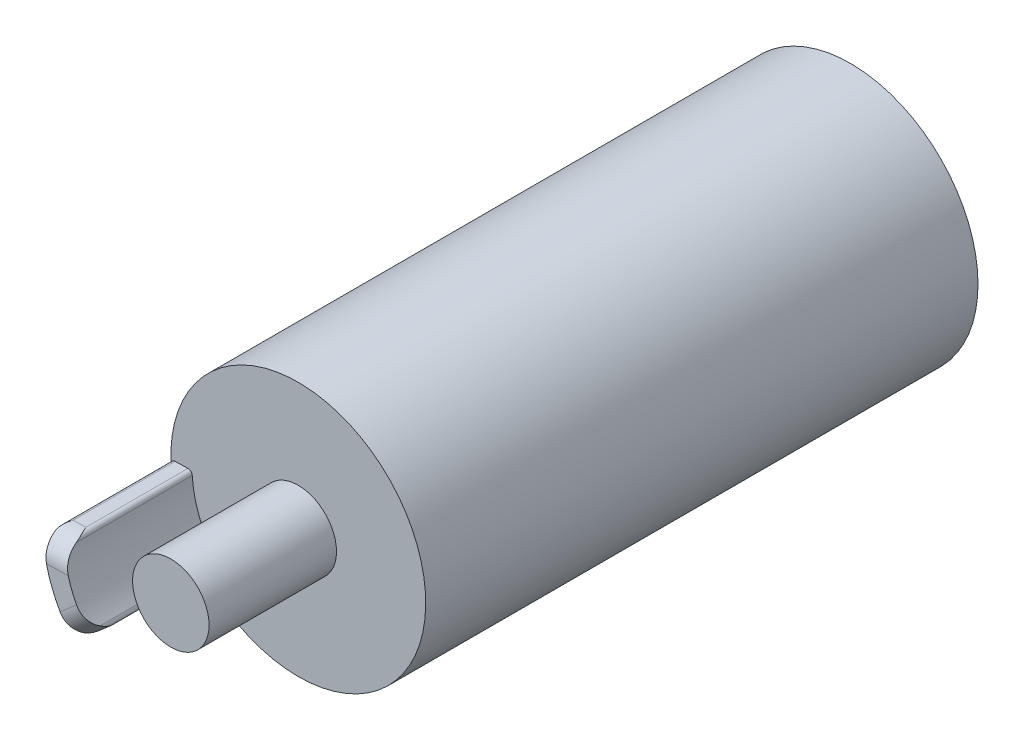
ISO-10303-21;
HEADER;
FILE_DESCRIPTION(('STEP AP214'),'2;1');
FILE_NAME('part.step','',(''),(''),'','','');
FILE_SCHEMA(('AUTOMOTIVE_DESIGN { 1 0 10303 214 1 1 1 1 }'));
ENDSEC;
DATA;
#1=APPLICATION_CONTEXT('core data for automotive mechanical design processes');
#2=APPLICATION_PROTOCOL_DEFINITION('international standard','automotive_design',2000,#1);
#3=PRODUCT_CONTEXT('',#1,'mechanical');
#4=PRODUCT('Part','Part','',(#3));
#5=PRODUCT_RELATED_PRODUCT_CATEGORY('part','',(#4));
#6=PRODUCT_DEFINITION_FORMATION('','',#4);
#7=PRODUCT_DEFINITION_CONTEXT('part definition',#1,'design');
#8=PRODUCT_DEFINITION('design','',#6,#7);
#9=PRODUCT_DEFINITION_SHAPE('','',#8);
#10=(LENGTH_UNIT() NAMED_UNIT(*) SI_UNIT(.MILLI.,.METRE.));
#11=(NAMED_UNIT(*) PLANE_ANGLE_UNIT() SI_UNIT($,.RADIAN.));
#12=(NAMED_UNIT(*) SI_UNIT($,.STERADIAN.) SOLID_ANGLE_UNIT());
#13=UNCERTAINTY_MEASURE_WITH_UNIT(LENGTH_MEASURE(1.E-05),#10,'distance_accuracy_value','');
#14=(GEOMETRIC_REPRESENTATION_CONTEXT(3) GLOBAL_UNCERTAINTY_ASSIGNED_CONTEXT((#13)) GLOBAL_UNIT_ASSIGNED_CONTEXT((#10,
#11,#12)) REPRESENTATION_CONTEXT('',''));
#15=CARTESIAN_POINT('',(0.,0.,0.));
#16=DIRECTION('',(0.,0.,1.));
#17=DIRECTION('',(1.,0.,0.));
#18=AXIS2_PLACEMENT_3D('',#15,#16,#17);
#19=CARTESIAN_POINT('',(0.,0.,13.));
#20=DIRECTION('',(0.,0.,1.));
#21=DIRECTION('',(1.,0.,0.));
#22=AXIS2_PLACEMENT_3D('',#19,#20,#21);
#23=PLANE('',#22);
#24=CARTESIAN_POINT('',(0.,0.,13.));
#25=DIRECTION('',(0.,0.,1.));
#26=DIRECTION('',(1.,0.,0.));
#27=AXIS2_PLACEMENT_3D('',#24,#25,#26);
#28=CIRCLE('',#27,0.9);
#29=CARTESIAN_POINT('',(0.9,0.,13.));
#30=VERTEX_POINT('',#29);
#31=EDGE_CURVE('E189',#30,#30,#28,.F.);
#32=ORIENTED_EDGE('',*,*,#31,.T.);
#33=EDGE_LOOP('',(#32));
#34=FACE_BOUND('',#33,.T.);
#35=DIRECTION('',(0.752217287045715,0.65891513343494,0.));
#36=VECTOR('',#35,1.);
#37=CARTESIAN_POINT('',(-1.9543178392422,-1.71191173347801,13.));
#38=LINE('',#37,#36);
#39=CARTESIAN_POINT('',(-2.1801328203152,-1.90971748847428,13.));
#40=VERTEX_POINT('',#39);
#41=CARTESIAN_POINT('',(-1.9543178392422,-1.71191173347801,13.));
#42=VERTEX_POINT('',#41);
#43=EDGE_CURVE('E146',#40,#42,#38,.T.);
#44=ORIENTED_EDGE('',*,*,#43,.F.);
#45=CARTESIAN_POINT('',(-2.24602433365869,-1.83449575976971,13.));
#46=DIRECTION('',(0.,0.,1.));
#47=DIRECTION('',(-1.,0.,0.));
#48=AXIS2_PLACEMENT_3D('',#45,#46,#47);
#49=CIRCLE('',#48,0.1);
#50=CARTESIAN_POINT('',(-2.32347344861244,-1.89775423424453,13.));
#51=VERTEX_POINT('',#50);
#52=EDGE_CURVE('E124',#51,#40,#49,.T.);
#53=ORIENTED_EDGE('',*,*,#52,.F.);
#54=CARTESIAN_POINT('',(0.,0.,13.));
#55=DIRECTION('',(0.,0.,1.));
#56=DIRECTION('',(1.,0.,0.));
#57=AXIS2_PLACEMENT_3D('',#54,#55,#56);
#58=CIRCLE('',#57,3.);
#59=CARTESIAN_POINT('',(-2.99534186834663,-0.167114008179209,13.));
#60=VERTEX_POINT('',#59);
#61=EDGE_CURVE('E132',#51,#60,#58,.T.);
#62=ORIENTED_EDGE('',*,*,#61,.T.);
#63=CARTESIAN_POINT('',(-2.89549713940174,-0.161543541239902,13.));
#64=DIRECTION('',(0.,0.,1.));
#65=DIRECTION('',(1.,0.,0.));
#66=AXIS2_PLACEMENT_3D('',#63,#64,#65);
#67=CIRCLE('',#66,0.0999999999999995);
#68=CARTESIAN_POINT('',(-2.89762137185673,-0.0615661056032692,13.));
#69=VERTEX_POINT('',#68);
#70=EDGE_CURVE('E164',#69,#60,#67,.T.);
#71=ORIENTED_EDGE('',*,*,#70,.F.);
#72=DIRECTION('',(-0.999774356366335,-0.021242324549825,0.));
#73=VECTOR('',#72,1.);
#74=CARTESIAN_POINT('',(-2.59748997199645,-0.055189178086747,13.));
#75=LINE('',#74,#73);
#76=CARTESIAN_POINT('',(-2.59748997199645,-0.055189178086747,13.));
#77=VERTEX_POINT('',#76);
#78=EDGE_CURVE('E161',#77,#69,#75,.T.);
#79=ORIENTED_EDGE('',*,*,#78,.F.);
#80=CARTESIAN_POINT('',(-2.59536573954147,-0.155166613723381,13.));
#81=DIRECTION('',(0.,0.,1.));
#82=DIRECTION('',(1.,0.,0.));
#83=AXIS2_PLACEMENT_3D('',#80,#81,#82);
#84=CIRCLE('',#83,0.1);
#85=CARTESIAN_POINT('',(-2.49554398032833,-0.149198667041711,13.));
#86=VERTEX_POINT('',#85);
#87=EDGE_CURVE('E158',#86,#77,#84,.T.);
#88=ORIENTED_EDGE('',*,*,#87,.F.);
#89=CARTESIAN_POINT('',(0.,0.,13.));
#90=DIRECTION('',(0.,0.,-1.));
#91=DIRECTION('',(1.,0.,0.));
#92=AXIS2_PLACEMENT_3D('',#89,#90,#91);
#93=CIRCLE('',#92,2.5);
#94=CARTESIAN_POINT('',(-1.94250899287086,-1.57374038920523,13.));
#95=VERTEX_POINT('',#94);
#96=EDGE_CURVE('E155',#95,#86,#93,.T.);
#97=ORIENTED_EDGE('',*,*,#96,.F.);
#98=CARTESIAN_POINT('',(-2.02020935258569,-1.63669000477344,13.));
#99=DIRECTION('',(0.,0.,1.));
#100=DIRECTION('',(-1.,0.,0.));
#101=AXIS2_PLACEMENT_3D('',#98,#99,#100);
#102=CIRCLE('',#101,0.0999999999999997);
#103=EDGE_CURVE('E148',#42,#95,#102,.T.);
#104=ORIENTED_EDGE('',*,*,#103,.F.);
#105=EDGE_LOOP('',(#44,#53,#62,#71,#79,#88,#97,#104));
#106=FACE_BOUND('',#105,.T.);
#107=ADVANCED_FACE('F38',(#34,#106),#23,.T.);
#108=CARTESIAN_POINT('',(0.,0.,13.));
#109=DIRECTION('',(0.,0.,-1.));
#110=DIRECTION('',(-1.,0.,0.));
#111=AXIS2_PLACEMENT_3D('',#108,#109,#110);
#112=CYLINDRICAL_SURFACE('',#111,1.8);
#113=CARTESIAN_POINT('',(0.,0.,0.));
#114=DIRECTION('',(0.,0.,1.));
#115=DIRECTION('',(1.,0.,0.));
#116=AXIS2_PLACEMENT_3D('',#113,#114,#115);
#117=CIRCLE('',#116,1.8);
#118=CARTESIAN_POINT('',(-1.8,0.,0.));
#119=VERTEX_POINT('',#118);
#120=EDGE_CURVE('E193',#119,#119,#117,.T.);
#121=CARTESIAN_POINT('',(0.,0.,12.));
#122=DIRECTION('',(0.,0.,1.));
#123=DIRECTION('',(1.,0.,0.));
#124=AXIS2_PLACEMENT_3D('',#121,#122,#123);
#125=CIRCLE('',#124,1.8);
#126=CARTESIAN_POINT('',(-1.8,0.,12.));
#127=VERTEX_POINT('',#126);
#128=EDGE_CURVE('E192',#127,#127,#125,.T.);
#129=CARTESIAN_POINT('',(-1.8,0.,0.));
#130=CARTESIAN_POINT('',(-1.8,0.,0.125));
#131=CARTESIAN_POINT('',(-1.8,0.,0.25));
#132=CARTESIAN_POINT('',(-1.8,0.,0.5));
#133=CARTESIAN_POINT('',(-1.8,0.,0.625000000000001));
#134=CARTESIAN_POINT('',(-1.8,0.,0.875000000000001));
#135=CARTESIAN_POINT('',(-1.8,0.,1.));
#136=CARTESIAN_POINT('',(-1.8,0.,1.25));
#137=CARTESIAN_POINT('',(-1.8,0.,1.375));
#138=CARTESIAN_POINT('',(-1.8,0.,1.625));
#139=CARTESIAN_POINT('',(-1.8,0.,1.75));
#140=CARTESIAN_POINT('',(-1.8,0.,2.));
#141=CARTESIAN_POINT('',(-1.8,0.,2.125));
#142=CARTESIAN_POINT('',(-1.8,0.,2.375));
#143=CARTESIAN_POINT('',(-1.8,0.,2.5));
#144=CARTESIAN_POINT('',(-1.8,0.,2.75));
#145=CARTESIAN_POINT('',(-1.8,0.,2.875));
#146=CARTESIAN_POINT('',(-1.8,0.,3.125));
#147=CARTESIAN_POINT('',(-1.8,0.,3.25));
#148=CARTESIAN_POINT('',(-1.8,0.,3.5));
#149=CARTESIAN_POINT('',(-1.8,0.,3.625));
#150=CARTESIAN_POINT('',(-1.8,0.,3.875));
#151=CARTESIAN_POINT('',(-1.8,0.,4.));
#152=CARTESIAN_POINT('',(-1.8,0.,4.25));
#153=CARTESIAN_POINT('',(-1.8,0.,4.375));
#154=CARTESIAN_POINT('',(-1.8,0.,4.625));
#155=CARTESIAN_POINT('',(-1.8,0.,4.75));
#156=CARTESIAN_POINT('',(-1.8,0.,5.));
#157=CARTESIAN_POINT('',(-1.8,0.,5.125));
#158=CARTESIAN_POINT('',(-1.8,0.,5.375));
#159=CARTESIAN_POINT('',(-1.8,0.,5.5));
#160=CARTESIAN_POINT('',(-1.8,0.,5.75));
#161=CARTESIAN_POINT('',(-1.8,0.,5.875));
#162=CARTESIAN_POINT('',(-1.8,0.,6.125));
#163=CARTESIAN_POINT('',(-1.8,0.,6.25));
#164=CARTESIAN_POINT('',(-1.8,0.,6.5));
#165=CARTESIAN_POINT('',(-1.8,0.,6.625));
#166=CARTESIAN_POINT('',(-1.8,0.,6.875));
#167=CARTESIAN_POINT('',(-1.8,0.,7.));
#168=CARTESIAN_POINT('',(-1.8,0.,7.25));
#169=CARTESIAN_POINT('',(-1.8,0.,7.375));
#170=CARTESIAN_POINT('',(-1.8,0.,7.625));
#171=CARTESIAN_POINT('',(-1.8,0.,7.75));
#172=CARTESIAN_POINT('',(-1.8,0.,8.));
#173=CARTESIAN_POINT('',(-1.8,0.,8.125));
#174=CARTESIAN_POINT('',(-1.8,0.,8.375));
#175=CARTESIAN_POINT('',(-1.8,0.,8.5));
#176=CARTESIAN_POINT('',(-1.8,0.,8.75));
#177=CARTESIAN_POINT('',(-1.8,0.,8.875));
#178=CARTESIAN_POINT('',(-1.8,0.,9.125));
#179=CARTESIAN_POINT('',(-1.8,0.,9.25));
#180=CARTESIAN_POINT('',(-1.8,0.,9.5));
#181=CARTESIAN_POINT('',(-1.8,0.,9.625));
#182=CARTESIAN_POINT('',(-1.8,0.,9.875));
#183=CARTESIAN_POINT('',(-1.8,0.,10.));
#184=CARTESIAN_POINT('',(-1.8,0.,10.25));
#185=CARTESIAN_POINT('',(-1.8,0.,10.375));
#186=CARTESIAN_POINT('',(-1.8,0.,10.625));
#187=CARTESIAN_POINT('',(-1.8,0.,10.75));
#188=CARTESIAN_POINT('',(-1.8,0.,11.));
#189=CARTESIAN_POINT('',(-1.8,0.,11.125));
#190=CARTESIAN_POINT('',(-1.8,0.,11.375));
#191=CARTESIAN_POINT('',(-1.8,0.,11.5));
#192=CARTESIAN_POINT('',(-1.8,0.,11.75));
#193=CARTESIAN_POINT('',(-1.8,0.,11.875));
#194=CARTESIAN_POINT('',(-1.8,0.,12.));
#195=B_SPLINE_CURVE_WITH_KNOTS('',3,(#129,#130,#131,#132,#133,#134,#135,#136,#137,#138,#139,
#140,#141,#142,#143,#144,#145,#146,#147,#148,#149,#150,#151,#152,#153,#154,#155,#156,#157,#158,
#159,#160,#161,#162,#163,#164,#165,#166,#167,#168,#169,#170,#171,#172,#173,#174,#175,#176,#177,
#178,#179,#180,#181,#182,#183,#184,#185,#186,#187,#188,#189,#190,#191,#192,#193,#194),
.UNSPECIFIED.,.F.,.F.,(4,2,2,2,2,2,2,2,2,2,2,2,2,2,2,2,2,2,2,2,2,2,2,2,2,2,2,2,2,2,2,2,4),(0.,
0.375,0.750000000000001,1.125,1.5,1.875,2.25,2.625,3.,3.375,3.75,4.125,4.5,4.875,5.25,5.625,6.,
6.375,6.75,7.125,7.5,7.875,8.25,8.625,9.,9.375,9.75,10.125,10.5,10.875,11.25,11.625,12.),.UNSPECIFIED.);
#196=EDGE_CURVE('BSEAM312',#119,#127,#195,.T.);
#197=ORIENTED_EDGE('',*,*,#120,.F.);
#198=ORIENTED_EDGE('',*,*,#128,.T.);
#199=ORIENTED_EDGE('',*,*,#196,.T.);
#200=ORIENTED_EDGE('',*,*,#196,.F.);
#201=EDGE_LOOP('',(#197,#199,#198,#200));
#202=FACE_BOUND('',#201,.T.);
#203=ADVANCED_FACE('F312',(#202),#112,.F.);
#204=CARTESIAN_POINT('',(0.,0.,0.));
#205=DIRECTION('',(0.,0.,1.));
#206=DIRECTION('',(1.,0.,0.));
#207=AXIS2_PLACEMENT_3D('',#204,#205,#206);
#208=PLANE('',#207);
#209=CARTESIAN_POINT('',(0.,0.,0.));
#210=DIRECTION('',(0.,0.,1.));
#211=DIRECTION('',(1.,0.,0.));
#212=AXIS2_PLACEMENT_3D('',#209,#210,#211);
#213=CIRCLE('',#212,3.);
#214=CARTESIAN_POINT('',(3.,0.,0.));
#215=VERTEX_POINT('',#214);
#216=EDGE_CURVE('E141',#215,#215,#213,.T.);
#217=ORIENTED_EDGE('',*,*,#216,.F.);
#218=EDGE_LOOP('',(#217));
#219=FACE_BOUND('',#218,.T.);
#220=ORIENTED_EDGE('',*,*,#120,.T.);
#221=EDGE_LOOP('',(#220));
#222=FACE_BOUND('',#221,.T.);
#223=ADVANCED_FACE('F225',(#219,#222),#208,.F.);
#224=CARTESIAN_POINT('',(0.,0.,13.));
#225=DIRECTION('',(0.,0.,-1.));
#226=DIRECTION('',(-1.,0.,0.));
#227=AXIS2_PLACEMENT_3D('',#224,#225,#226);
#228=CYLINDRICAL_SURFACE('',#227,3.);
#229=CARTESIAN_POINT('',(0.,0.,16.));
#230=DIRECTION('',(0.,0.,1.));
#231=DIRECTION('',(1.,0.,0.));
#232=AXIS2_PLACEMENT_3D('',#229,#230,#231);
#233=CIRCLE('',#232,3.);
#234=CARTESIAN_POINT('',(-2.9259790424905,-0.662304041137002,16.));
#235=VERTEX_POINT('',#234);
#236=CARTESIAN_POINT('',(-2.60640731481617,-1.48547666062876,16.));
#237=VERTEX_POINT('',#236);
#238=EDGE_CURVE('E129',#235,#237,#233,.T.);
#239=ORIENTED_EDGE('',*,*,#238,.F.);
#240=CARTESIAN_POINT('',(-2.9259790424905,-0.662304041137002,16.));
#241=CARTESIAN_POINT('',(-2.93344017588472,-0.629440230710288,16.0000327749738));
#242=CARTESIAN_POINT('',(-2.94030690482443,-0.596436051882366,15.9972761598285));
#243=CARTESIAN_POINT('',(-2.95278636173561,-0.531150687062504,15.9863011016426));
#244=CARTESIAN_POINT('',(-2.95840065685799,-0.498868643525983,15.9780895360874));
#245=CARTESIAN_POINT('',(-2.96833639573226,-0.435897606090179,15.9563050942699));
#246=CARTESIAN_POINT('',(-2.97265593218248,-0.405211016871969,15.9427243763182));
#247=CARTESIAN_POINT('',(-2.98007720302971,-0.346432663319819,15.910557549508));
#248=CARTESIAN_POINT('',(-2.98317932036184,-0.318340085177884,15.8919730176889));
#249=CARTESIAN_POINT('',(-2.98810836225695,-0.267943521462508,15.8521579695631));
#250=CARTESIAN_POINT('',(-2.99002374534464,-0.245347385821983,15.8313063692612));
#251=CARTESIAN_POINT('',(-2.99316074453834,-0.203543874675177,15.7863593462375));
#252=CARTESIAN_POINT('',(-2.99438163048752,-0.184340080259205,15.7622605423723));
#253=CARTESIAN_POINT('',(-2.99534186834663,-0.16711400817921,15.7368031847469));
#254=B_SPLINE_CURVE_WITH_KNOTS('',3,(#240,#241,#242,#243,#244,#245,#246,#247,#248,#249,#250,
#251,#252,#253),.UNSPECIFIED.,.F.,.F.,(4,2,2,2,2,2,4),(0.,0.100990458432857,0.201853831286564,
0.302865063340039,0.403844497130937,0.495901076947136,0.588054262053954),.UNSPECIFIED.);
#255=CARTESIAN_POINT('',(-2.99534186834663,-0.167114008179209,15.7368031847469));
#256=VERTEX_POINT('',#255);
#257=EDGE_CURVE('E215',#235,#256,#254,.T.);
#258=ORIENTED_EDGE('',*,*,#257,.T.);
#259=DIRECTION('',(0.,0.,-1.));
#260=VECTOR('',#259,1.);
#261=CARTESIAN_POINT('',(-2.99534186834663,-0.167114008179209,16.));
#262=LINE('',#261,#260);
#263=EDGE_CURVE('E128',#256,#60,#262,.T.);
#264=ORIENTED_EDGE('',*,*,#263,.T.);
#265=ORIENTED_EDGE('',*,*,#61,.F.);
#266=DIRECTION('',(0.,0.,-1.));
#267=VECTOR('',#266,1.);
#268=CARTESIAN_POINT('',(-2.32347344861244,-1.89775423424453,16.));
#269=LINE('',#268,#267);
#270=CARTESIAN_POINT('',(-2.32347344861244,-1.89775423424453,15.7368031847469));
#271=VERTEX_POINT('',#270);
#272=EDGE_CURVE('E120',#271,#51,#269,.T.);
#273=ORIENTED_EDGE('',*,*,#272,.F.);
#274=CARTESIAN_POINT('',(-2.32347344861244,-1.89775423424453,15.7368031847469));
#275=CARTESIAN_POINT('',(-2.33535173227123,-1.88321480034998,15.7645220014843));
#276=CARTESIAN_POINT('',(-2.34859011423977,-1.86672589056757,15.7906264797424));
#277=CARTESIAN_POINT('',(-2.37711433984957,-1.83026172492721,15.838914328036));
#278=CARTESIAN_POINT('',(-2.39239661816057,-1.8102925220367,15.8611043734454));
#279=CARTESIAN_POINT('',(-2.42439852000105,-1.76720445144135,15.9009923524608));
#280=CARTESIAN_POINT('',(-2.4411196752949,-1.7440822114588,15.9186854175718));
#281=CARTESIAN_POINT('',(-2.47528958265152,-1.69523748992887,15.9490753852537));
#282=CARTESIAN_POINT('',(-2.49273830722924,-1.66951510655377,15.9617724763666));
#283=CARTESIAN_POINT('',(-2.52651067983955,-1.61790715121464,15.981181638981));
#284=CARTESIAN_POINT('',(-2.54283138662521,-1.59214796295996,15.9882376885445));
#285=CARTESIAN_POINT('',(-2.57505463555407,-1.53950379171852,15.9976600456921));
#286=CARTESIAN_POINT('',(-2.5909568330779,-1.51261792545487,16.0000226007507));
#287=CARTESIAN_POINT('',(-2.60640731481617,-1.48547666062876,16.));
#288=B_SPLINE_CURVE_WITH_KNOTS('',3,(#274,#275,#276,#277,#278,#279,#280,#281,#282,#283,#284,
#285,#286,#287),.UNSPECIFIED.,.F.,.F.,(4,2,2,2,2,2,4),(0.,0.100309155347823,0.200445561762977,
0.300689919896136,0.400930494567482,0.494455442379958,0.588055134869861),.UNSPECIFIED.);
#289=EDGE_CURVE('E208',#271,#237,#288,.T.);
#290=ORIENTED_EDGE('',*,*,#289,.T.);
#291=EDGE_LOOP('',(#239,#258,#264,#265,#273,#290));
#292=FACE_BOUND('',#291,.T.);
#293=ORIENTED_EDGE('',*,*,#216,.T.);
#294=EDGE_LOOP('',(#293));
#295=FACE_BOUND('',#294,.T.);
#296=ADVANCED_FACE('F134',(#292,#295),#228,.T.);
#297=CARTESIAN_POINT('',(0.,0.,12.));
#298=DIRECTION('',(0.,0.,1.));
#299=DIRECTION('',(1.,0.,0.));
#300=AXIS2_PLACEMENT_3D('',#297,#298,#299);
#301=PLANE('',#300);
#302=CARTESIAN_POINT('',(0.,0.,12.));
#303=DIRECTION('',(0.,0.,1.));
#304=DIRECTION('',(1.,0.,0.));
#305=AXIS2_PLACEMENT_3D('',#302,#303,#304);
#306=CIRCLE('',#305,0.9);
#307=CARTESIAN_POINT('',(0.9,0.,12.));
#308=VERTEX_POINT('',#307);
#309=EDGE_CURVE('E140',#308,#308,#306,.F.);
#310=ORIENTED_EDGE('',*,*,#309,.F.);
#311=EDGE_LOOP('',(#310));
#312=FACE_BOUND('',#311,.T.);
#313=ORIENTED_EDGE('',*,*,#128,.F.);
#314=EDGE_LOOP('',(#313));
#315=FACE_BOUND('',#314,.T.);
#316=ADVANCED_FACE('F224',(#312,#315),#301,.F.);
#317=CARTESIAN_POINT('',(0.,0.,2.5));
#318=DIRECTION('',(0.,0.,1.));
#319=DIRECTION('',(1.,0.,0.));
#320=AXIS2_PLACEMENT_3D('',#317,#318,#319);
#321=DEGENERATE_TOROIDAL_SURFACE('',#320,0.4,0.5,.T.);
#322=CARTESIAN_POINT('',(0.,0.,2.));
#323=DIRECTION('',(0.,0.,1.));
#324=DIRECTION('',(1.,0.,0.));
#325=AXIS2_PLACEMENT_3D('',#322,#323,#324);
#326=CIRCLE('',#325,0.4);
#327=CARTESIAN_POINT('',(0.4,0.,2.));
#328=VERTEX_POINT('',#327);
#329=EDGE_CURVE('E186',#328,#328,#326,.F.);
#330=ORIENTED_EDGE('',*,*,#329,.F.);
#331=EDGE_LOOP('',(#330));
#332=FACE_BOUND('',#331,.T.);
#333=CARTESIAN_POINT('',(0.,0.,2.5));
#334=DIRECTION('',(0.,0.,1.));
#335=DIRECTION('',(1.,0.,0.));
#336=AXIS2_PLACEMENT_3D('',#333,#334,#335);
#337=CIRCLE('',#336,0.9);
#338=CARTESIAN_POINT('',(0.9,0.,2.5));
#339=VERTEX_POINT('',#338);
#340=EDGE_CURVE('E183',#339,#339,#337,.T.);
#341=ORIENTED_EDGE('',*,*,#340,.F.);
#342=EDGE_LOOP('',(#341));
#343=FACE_BOUND('',#342,.T.);
#344=ADVANCED_FACE('F322',(#332,#343),#321,.T.);
#345=CARTESIAN_POINT('',(0.,0.,2.));
#346=DIRECTION('',(0.,0.,1.));
#347=DIRECTION('',(1.,0.,0.));
#348=AXIS2_PLACEMENT_3D('',#345,#346,#347);
#349=PLANE('',#348);
#350=ORIENTED_EDGE('',*,*,#329,.T.);
#351=EDGE_LOOP('',(#350));
#352=FACE_BOUND('',#351,.T.);
#353=ADVANCED_FACE('F326',(#352),#349,.F.);
#354=CARTESIAN_POINT('',(0.,0.,16.));
#355=DIRECTION('',(0.,0.,-1.));
#356=DIRECTION('',(-1.,0.,0.));
#357=AXIS2_PLACEMENT_3D('',#354,#355,#356);
#358=CYLINDRICAL_SURFACE('',#357,0.9);
#359=ORIENTED_EDGE('',*,*,#340,.T.);
#360=EDGE_LOOP('',(#359));
#361=FACE_BOUND('',#360,.T.);
#362=ORIENTED_EDGE('',*,*,#309,.T.);
#363=EDGE_LOOP('',(#362));
#364=FACE_BOUND('',#363,.T.);
#365=ADVANCED_FACE('F332',(#361,#364),#358,.T.);
#366=ORIENTED_EDGE('',*,*,#31,.F.);
#367=EDGE_LOOP('',(#366));
#368=FACE_BOUND('',#367,.T.);
#369=CARTESIAN_POINT('',(0.,0.,16.));
#370=DIRECTION('',(0.,0.,1.));
#371=DIRECTION('',(1.,0.,0.));
#372=AXIS2_PLACEMENT_3D('',#369,#370,#371);
#373=CIRCLE('',#372,0.9);
#374=CARTESIAN_POINT('',(0.9,0.,16.));
#375=VERTEX_POINT('',#374);
#376=EDGE_CURVE('E180',#375,#375,#373,.T.);
#377=ORIENTED_EDGE('',*,*,#376,.F.);
#378=EDGE_LOOP('',(#377));
#379=FACE_BOUND('',#378,.T.);
#380=ADVANCED_FACE('F328',(#368,#379),#358,.T.);
#381=CARTESIAN_POINT('',(0.,0.,16.));
#382=DIRECTION('',(0.,0.,1.));
#383=DIRECTION('',(1.,0.,0.));
#384=AXIS2_PLACEMENT_3D('',#381,#382,#383);
#385=PLANE('',#384);
#386=ORIENTED_EDGE('',*,*,#376,.T.);
#387=EDGE_LOOP('',(#386));
#388=FACE_BOUND('',#387,.T.);
#389=ADVANCED_FACE('F331',(#388),#385,.T.);
#390=CARTESIAN_POINT('',(-2.24602433365869,-1.83449575976971,16.));
#391=DIRECTION('',(0.,0.,-1.));
#392=DIRECTION('',(-1.,0.,0.));
#393=AXIS2_PLACEMENT_3D('',#390,#391,#392);
#394=CYLINDRICAL_SURFACE('',#393,0.1);
#395=DIRECTION('',(0.,0.,-1.));
#396=VECTOR('',#395,1.);
#397=CARTESIAN_POINT('',(-2.1801328203152,-1.90971748847428,16.));
#398=LINE('',#397,#396);
#399=CARTESIAN_POINT('',(-2.1801328203152,-1.90971748847428,15.4));
#400=VERTEX_POINT('',#399);
#401=EDGE_CURVE('E178',#400,#40,#398,.T.);
#402=ORIENTED_EDGE('',*,*,#401,.F.);
#403=CARTESIAN_POINT('',(-2.32347344861244,-1.89775423424453,15.7368031847469));
#404=CARTESIAN_POINT('',(-2.31738131319483,-1.9051293299375,15.722717419934));
#405=CARTESIAN_POINT('',(-2.31075692109073,-1.91117290428648,15.708278589208));
#406=CARTESIAN_POINT('',(-2.29698790732195,-1.92095774456537,15.6789821759855));
#407=CARTESIAN_POINT('',(-2.28984672385359,-1.92471289752878,15.6641277032664));
#408=CARTESIAN_POINT('',(-2.26998095100198,-1.93253653783875,15.6225580808901));
#409=CARTESIAN_POINT('',(-2.25718930484449,-1.93462172367766,15.5955136794276));
#410=CARTESIAN_POINT('',(-2.23267304906019,-1.93435784787557,15.5409144146984));
#411=CARTESIAN_POINT('',(-2.22095290219456,-1.93199105414298,15.5133579448251));
#412=CARTESIAN_POINT('',(-2.19963019562753,-1.92379650953372,15.4587015200952));
#413=CARTESIAN_POINT('',(-2.18998403053375,-1.9180521165564,15.4316062249324));
#414=CARTESIAN_POINT('',(-2.18106512226154,-1.91052654628706,15.4030236467977));
#415=CARTESIAN_POINT('',(-2.18059707395379,-1.91012414734265,15.4015117745174));
#416=CARTESIAN_POINT('',(-2.1801328203152,-1.90971748847428,15.4));
#417=B_SPLINE_CURVE_WITH_KNOTS('',3,(#403,#404,#405,#406,#407,#408,#409,#410,#411,#412,#413,
#414,#415,#416),.UNSPECIFIED.,.F.,.F.,(4,2,2,2,2,2,4),(0.,0.0508788723495248,0.101445834795998,
0.190932147254145,0.280775635712408,0.368489737678618,0.373388747190786),.UNSPECIFIED.);
#418=EDGE_CURVE('E11',#400,#271,#417,.F.);
#419=ORIENTED_EDGE('',*,*,#418,.T.);
#420=ORIENTED_EDGE('',*,*,#272,.T.);
#421=ORIENTED_EDGE('',*,*,#52,.T.);
#422=EDGE_LOOP('',(#402,#419,#420,#421));
#423=FACE_BOUND('',#422,.T.);
#424=ADVANCED_FACE('F122',(#423),#394,.T.);
#425=CARTESIAN_POINT('',(-1.9543178392422,-1.71191173347801,16.));
#426=DIRECTION('',(-0.65891513343494,0.752217287045715,0.));
#427=DIRECTION('',(-0.752217287045715,-0.65891513343494,0.));
#428=AXIS2_PLACEMENT_3D('',#425,#426,#427);
#429=PLANE('',#428);
#430=DIRECTION('',(0.,0.,-1.));
#431=VECTOR('',#430,1.);
#432=CARTESIAN_POINT('',(-1.9543178392422,-1.71191173347801,16.));
#433=LINE('',#432,#431);
#434=CARTESIAN_POINT('',(-1.9543178392422,-1.71191173347801,15.4));
#435=VERTEX_POINT('',#434);
#436=EDGE_CURVE('E176',#435,#42,#433,.T.);
#437=ORIENTED_EDGE('',*,*,#436,.F.);
#438=DIRECTION('',(0.752217287045715,0.65891513343494,0.));
#439=VECTOR('',#438,1.);
#440=CARTESIAN_POINT('',(-1.9543178392422,-1.71191173347801,15.4));
#441=LINE('',#440,#439);
#442=EDGE_CURVE('E52',#435,#400,#441,.F.);
#443=ORIENTED_EDGE('',*,*,#442,.T.);
#444=ORIENTED_EDGE('',*,*,#401,.T.);
#445=ORIENTED_EDGE('',*,*,#43,.T.);
#446=EDGE_LOOP('',(#437,#443,#444,#445));
#447=FACE_BOUND('',#446,.T.);
#448=ADVANCED_FACE('F341',(#447),#429,.F.);
#449=CARTESIAN_POINT('',(-2.02020935258569,-1.63669000477344,16.));
#450=DIRECTION('',(0.,0.,-1.));
#451=DIRECTION('',(-1.,0.,0.));
#452=AXIS2_PLACEMENT_3D('',#449,#450,#451);
#453=CYLINDRICAL_SURFACE('',#452,0.0999999999999997);
#454=DIRECTION('',(0.,0.,-1.));
#455=VECTOR('',#454,1.);
#456=CARTESIAN_POINT('',(-1.94250899287086,-1.57374038920523,16.));
#457=LINE('',#456,#455);
#458=CARTESIAN_POINT('',(-1.94250899287086,-1.57374038920523,15.7257898912711));
#459=VERTEX_POINT('',#458);
#460=EDGE_CURVE('E174',#459,#95,#457,.T.);
#461=ORIENTED_EDGE('',*,*,#460,.F.);
#462=CARTESIAN_POINT('',(-1.94250899287086,-1.57374038920523,15.7257898912711));
#463=CARTESIAN_POINT('',(-1.93885264565796,-1.5782664075576,15.7168008787093));
#464=CARTESIAN_POINT('',(-1.93572748055759,-1.58291548006118,15.7076779881781));
#465=CARTESIAN_POINT('',(-1.93042588997789,-1.59232385463545,15.6892414804425));
#466=CARTESIAN_POINT('',(-1.928247310614,-1.59708288022961,15.6799283472613));
#467=CARTESIAN_POINT('',(-1.92296129946411,-1.61129912880728,15.6518647746879));
#468=CARTESIAN_POINT('',(-1.92106415732925,-1.62075074065529,15.6328849242181));
#469=CARTESIAN_POINT('',(-1.91946112445971,-1.64425426890518,15.5837462165869));
#470=CARTESIAN_POINT('',(-1.92160250065964,-1.6578831202382,15.5533385880019));
#471=CARTESIAN_POINT('',(-1.93041225010818,-1.6826083538014,15.4921344348572));
#472=CARTESIAN_POINT('',(-1.93708851467793,-1.69370027638218,15.4613373243765));
#473=CARTESIAN_POINT('',(-1.94782632825003,-1.70577867401126,15.4218674554195));
#474=CARTESIAN_POINT('',(-1.95031847642372,-1.70829853652684,15.4132018897456));
#475=CARTESIAN_POINT('',(-1.95339303129947,-1.71109404117915,15.4030237535367));
#476=CARTESIAN_POINT('',(-1.95385354650144,-1.7115050323621,15.4015118881247));
#477=CARTESIAN_POINT('',(-1.9543178392422,-1.71191173347801,15.4));
#478=B_SPLINE_CURVE_WITH_KNOTS('',3,(#462,#463,#464,#465,#466,#467,#468,#469,#470,#471,#472,
#473,#474,#475,#476,#477),.UNSPECIFIED.,.F.,.F.,(4,2,2,2,2,2,2,4),(0.,0.0320830822074792,
0.0640927745162501,0.127741205985373,0.22740376077343,0.327240187728653,0.355322629744823,
0.360221639225912),.UNSPECIFIED.);
#479=EDGE_CURVE('E66',#459,#435,#478,.T.);
#480=ORIENTED_EDGE('',*,*,#479,.T.);
#481=ORIENTED_EDGE('',*,*,#436,.T.);
#482=ORIENTED_EDGE('',*,*,#103,.T.);
#483=EDGE_LOOP('',(#461,#480,#481,#482));
#484=FACE_BOUND('',#483,.T.);
#485=ADVANCED_FACE('F269',(#484),#453,.T.);
#486=CARTESIAN_POINT('',(0.,0.,16.));
#487=DIRECTION('',(0.,0.,-1.));
#488=DIRECTION('',(-1.,0.,0.));
#489=AXIS2_PLACEMENT_3D('',#486,#487,#488);
#490=CYLINDRICAL_SURFACE('',#489,2.5);
#491=DIRECTION('',(0.,0.,-1.));
#492=VECTOR('',#491,1.);
#493=CARTESIAN_POINT('',(-2.49554398032833,-0.149198667041711,16.));
#494=LINE('',#493,#492);
#495=CARTESIAN_POINT('',(-2.49554398032833,-0.149198667041711,15.7257898912711));
#496=VERTEX_POINT('',#495);
#497=EDGE_CURVE('E172',#496,#86,#494,.T.);
#498=ORIENTED_EDGE('',*,*,#497,.F.);
#499=CARTESIAN_POINT('',(-2.49554398032833,-0.149198667041711,15.7257898912711));
#500=CARTESIAN_POINT('',(-2.49446498761506,-0.1672710617652,15.7538270632408));
#501=CARTESIAN_POINT('',(-2.49304476220252,-0.187720781163503,15.7803115590472));
#502=CARTESIAN_POINT('',(-2.48925520568243,-0.23262079763054,15.8294614607902));
#503=CARTESIAN_POINT('',(-2.48688780392146,-0.257062902900096,15.8521344979372));
#504=CARTESIAN_POINT('',(-2.48093139365659,-0.309304836631387,15.8930920009677));
#505=CARTESIAN_POINT('',(-2.47734088134195,-0.337108771176714,15.9113710170005));
#506=CARTESIAN_POINT('',(-2.46874261951253,-0.395187619046112,15.9430223175168));
#507=CARTESIAN_POINT('',(-2.46373461087255,-0.425462983438803,15.9563937038344));
#508=CARTESIAN_POINT('',(-2.45210712355281,-0.4880467156422,15.9780775804599));
#509=CARTESIAN_POINT('',(-2.44546268608235,-0.520380193724928,15.9863039730952));
#510=CARTESIAN_POINT('',(-2.43066526256795,-0.585683251926795,15.9972873755061));
#511=CARTESIAN_POINT('',(-2.42250987852193,-0.61865376751325,16.0000356082799));
#512=CARTESIAN_POINT('',(-2.41363920336767,-0.651418295695393,16.));
#513=B_SPLINE_CURVE_WITH_KNOTS('',3,(#499,#500,#501,#502,#503,#504,#505,#506,#507,#508,#509,
#510,#511,#512),.UNSPECIFIED.,.F.,.F.,(4,2,2,2,2,2,4),(0.,0.0999996019209094,0.199796538789009,
0.299716621219427,0.399654981335561,0.501223883063276,0.602955386143679),.UNSPECIFIED.);
#514=CARTESIAN_POINT('',(-2.41363920336767,-0.651418295695393,16.));
#515=VERTEX_POINT('',#514);
#516=EDGE_CURVE('E274',#496,#515,#513,.T.);
#517=ORIENTED_EDGE('',*,*,#516,.T.);
#518=CARTESIAN_POINT('',(0.,0.,16.));
#519=DIRECTION('',(0.,0.,-1.));
#520=DIRECTION('',(1.,0.,0.));
#521=AXIS2_PLACEMENT_3D('',#518,#519,#520);
#522=CIRCLE('',#521,2.5);
#523=CARTESIAN_POINT('',(-2.22092945035972,-1.14781199528706,16.));
#524=VERTEX_POINT('',#523);
#525=EDGE_CURVE('E165',#524,#515,#522,.T.);
#526=ORIENTED_EDGE('',*,*,#525,.F.);
#527=CARTESIAN_POINT('',(-2.22092945035972,-1.14781199528706,16.));
#528=CARTESIAN_POINT('',(-2.2054908176939,-1.17774110416743,16.0000340890018));
#529=CARTESIAN_POINT('',(-2.18939707281833,-1.20734437093837,15.9973298650766));
#530=CARTESIAN_POINT('',(-2.15652691343449,-1.26509264701563,15.9865196997182));
#531=CARTESIAN_POINT('',(-2.13975151777277,-1.29323969940381,15.9784215603978));
#532=CARTESIAN_POINT('',(-2.10606759543175,-1.3474079666966,15.9568790078347));
#533=CARTESIAN_POINT('',(-2.08915888486834,-1.37342530654696,15.9434250993861));
#534=CARTESIAN_POINT('',(-2.05597146381779,-1.42262447714253,15.9115041108853));
#535=CARTESIAN_POINT('',(-2.03969264457475,-1.44580679888372,15.8930379007009));
#536=CARTESIAN_POINT('',(-2.00872740730065,-1.48852364564089,15.8518751535542));
#537=CARTESIAN_POINT('',(-1.9940223292378,-1.50810353043934,15.8292396234517));
#538=CARTESIAN_POINT('',(-1.96659678936222,-1.54369859436014,15.7801859892941));
#539=CARTESIAN_POINT('',(-1.95388020457575,-1.55970683503705,15.7537606837733));
#540=CARTESIAN_POINT('',(-1.94250899287086,-1.57374038920523,15.7257898912711));
#541=B_SPLINE_CURVE_WITH_KNOTS('',3,(#527,#528,#529,#530,#531,#532,#533,#534,#535,#536,#537,
#538,#539,#540),.UNSPECIFIED.,.F.,.F.,(4,2,2,2,2,2,4),(0.,0.100929119012268,0.201712563656054,
0.302675488056522,0.403620901879016,0.503192201697565,0.602955281069557),.UNSPECIFIED.);
#542=EDGE_CURVE('E252',#524,#459,#541,.T.);
#543=ORIENTED_EDGE('',*,*,#542,.T.);
#544=ORIENTED_EDGE('',*,*,#460,.T.);
#545=ORIENTED_EDGE('',*,*,#96,.T.);
#546=EDGE_LOOP('',(#498,#517,#526,#543,#544,#545));
#547=FACE_BOUND('',#546,.T.);
#548=ADVANCED_FACE('F264',(#547),#490,.F.);
#549=CARTESIAN_POINT('',(-2.59536573954147,-0.155166613723381,16.));
#550=DIRECTION('',(0.,0.,-1.));
#551=DIRECTION('',(-1.,0.,0.));
#552=AXIS2_PLACEMENT_3D('',#549,#550,#551);
#553=CYLINDRICAL_SURFACE('',#552,0.1);
#554=DIRECTION('',(0.,0.,-1.));
#555=VECTOR('',#554,1.);
#556=CARTESIAN_POINT('',(-2.59748997199645,-0.0551891780867468,16.));
#557=LINE('',#556,#555);
#558=CARTESIAN_POINT('',(-2.59748997199645,-0.0551891780867468,15.4));
#559=VERTEX_POINT('',#558);
#560=EDGE_CURVE('E170',#559,#77,#557,.T.);
#561=ORIENTED_EDGE('',*,*,#560,.F.);
#562=CARTESIAN_POINT('',(-2.49554398032833,-0.149198667041711,15.7257898912711));
#563=CARTESIAN_POINT('',(-2.49589932043497,-0.143391133100716,15.7168008787093));
#564=CARTESIAN_POINT('',(-2.49672973006277,-0.137851191593965,15.7076779881781));
#565=CARTESIAN_POINT('',(-2.49916514410848,-0.127330111172713,15.6892414804425));
#566=CARTESIAN_POINT('',(-2.50076837229924,-0.122347722988415,15.6799283472613));
#567=CARTESIAN_POINT('',(-2.50645937512668,-0.108288700109257,15.6518647746879));
#568=CARTESIAN_POINT('',(-2.51143661875782,-0.100032843966995,15.6328849242181));
#569=CARTESIAN_POINT('',(-2.52611239443621,-0.0816044104249994,15.5837462165869));
#570=CARTESIAN_POINT('',(-2.53688884190718,-0.0729905111573766,15.553338588002));
#571=CARTESIAN_POINT('',(-2.56007411841345,-0.0606863730962153,15.4921344348572));
#572=CARTESIAN_POINT('',(-2.57248576251611,-0.0570047503817011,15.4613373243765));
#573=CARTESIAN_POINT('',(-2.58856065496007,-0.0553355701904665,15.4218674554195));
#574=CARTESIAN_POINT('',(-2.59210025195858,-0.0551573492454729,15.4132018897456));
#575=CARTESIAN_POINT('',(-2.59625568284623,-0.0551686666214533,15.4030237535367));
#576=CARTESIAN_POINT('',(-2.59687288076511,-0.055176064772413,15.4015118881247));
#577=CARTESIAN_POINT('',(-2.59748997199645,-0.055189178086747,15.4));
#578=B_SPLINE_CURVE_WITH_KNOTS('',3,(#562,#563,#564,#565,#566,#567,#568,#569,#570,#571,#572,
#573,#574,#575,#576,#577),.UNSPECIFIED.,.F.,.F.,(4,2,2,2,2,2,2,4),(0.,0.0320830822074788,
0.064092774516246,0.12774120598537,0.227403760773428,0.327240187728652,0.355322629744823,
0.360221639225912),.UNSPECIFIED.);
#579=EDGE_CURVE('E245',#559,#496,#578,.F.);
#580=ORIENTED_EDGE('',*,*,#579,.T.);
#581=ORIENTED_EDGE('',*,*,#497,.T.);
#582=ORIENTED_EDGE('',*,*,#87,.T.);
#583=EDGE_LOOP('',(#561,#580,#581,#582));
#584=FACE_BOUND('',#583,.T.);
#585=ADVANCED_FACE('F259',(#584),#553,.T.);
#586=CARTESIAN_POINT('',(-2.59748997199645,-0.055189178086747,16.));
#587=DIRECTION('',(0.021242324549825,-0.999774356366335,0.));
#588=DIRECTION('',(0.999774356366335,0.021242324549825,0.));
#589=AXIS2_PLACEMENT_3D('',#586,#587,#588);
#590=PLANE('',#589);
#591=DIRECTION('',(0.,0.,-1.));
#592=VECTOR('',#591,1.);
#593=CARTESIAN_POINT('',(-2.89762137185673,-0.0615661056032687,16.));
#594=LINE('',#593,#592);
#595=CARTESIAN_POINT('',(-2.89762137185673,-0.0615661056032687,15.4));
#596=VERTEX_POINT('',#595);
#597=EDGE_CURVE('E168',#596,#69,#594,.T.);
#598=ORIENTED_EDGE('',*,*,#597,.F.);
#599=DIRECTION('',(-0.999774356366335,-0.021242324549825,0.));
#600=VECTOR('',#599,1.);
#601=CARTESIAN_POINT('',(-2.59748997199645,-0.055189178086747,15.4));
#602=LINE('',#601,#600);
#603=EDGE_CURVE('E253',#596,#559,#602,.F.);
#604=ORIENTED_EDGE('',*,*,#603,.T.);
#605=ORIENTED_EDGE('',*,*,#560,.T.);
#606=ORIENTED_EDGE('',*,*,#78,.T.);
#607=EDGE_LOOP('',(#598,#604,#605,#606));
#608=FACE_BOUND('',#607,.T.);
#609=ADVANCED_FACE('F263',(#608),#590,.F.);
#610=CARTESIAN_POINT('',(-2.89549713940174,-0.161543541239902,16.));
#611=DIRECTION('',(0.,0.,-1.));
#612=DIRECTION('',(-1.,0.,0.));
#613=AXIS2_PLACEMENT_3D('',#610,#611,#612);
#614=CYLINDRICAL_SURFACE('',#613,0.0999999999999995);
#615=ORIENTED_EDGE('',*,*,#263,.F.);
#616=CARTESIAN_POINT('',(-2.99534186834663,-0.167114008179209,15.7368031847469));
#617=CARTESIAN_POINT('',(-2.99582187488611,-0.157560174176627,15.722717419934));
#618=CARTESIAN_POINT('',(-2.99501061125929,-0.148629932691183,15.708278589208));
#619=CARTESIAN_POINT('',(-2.99145065645416,-0.132117647530317,15.6789821759855));
#620=CARTESIAN_POINT('',(-2.98871387304947,-0.124527674427379,15.6641277032664));
#621=CARTESIAN_POINT('',(-2.97933089069374,-0.105349094688423,15.6225580808901));
#622=CARTESIAN_POINT('',(-2.97129697708069,-0.0951790188057229,15.5955136794276));
#623=CARTESIAN_POINT('',(-2.95302468924207,-0.0788315442221459,15.5409144146984));
#624=CARTESIAN_POINT('',(-2.94277764411492,-0.0726702439303772,15.5133579448251));
#625=CARTESIAN_POINT('',(-2.92151117591815,-0.0643308370485829,15.4587015200953));
#626=CARTESIAN_POINT('',(-2.91051581521026,-0.0620617855720873,15.4316062249326));
#627=CARTESIAN_POINT('',(-2.89885536588238,-0.0615980463004593,15.4030236467977));
#628=CARTESIAN_POINT('',(-2.89823840572233,-0.0615792237144247,15.4015117745174));
#629=CARTESIAN_POINT('',(-2.89762137185673,-0.0615661056032687,15.4));
#630=B_SPLINE_CURVE_WITH_KNOTS('',3,(#616,#617,#618,#619,#620,#621,#622,#623,#624,#625,#626,
#627,#628,#629),.UNSPECIFIED.,.F.,.F.,(4,2,2,2,2,2,4),(0.,0.050878872349509,0.101445834795998,
0.190932147254155,0.280775635712406,0.368489737678619,0.373388747190786),.UNSPECIFIED.);
#631=EDGE_CURVE('E237',#256,#596,#630,.T.);
#632=ORIENTED_EDGE('',*,*,#631,.T.);
#633=ORIENTED_EDGE('',*,*,#597,.T.);
#634=ORIENTED_EDGE('',*,*,#70,.T.);
#635=EDGE_LOOP('',(#615,#632,#633,#634));
#636=FACE_BOUND('',#635,.T.);
#637=ADVANCED_FACE('F303',(#636),#614,.T.);
#638=CARTESIAN_POINT('',(-2.24602433365869,-1.83449575976971,16.));
#639=DIRECTION('',(0.,0.,-1.));
#640=DIRECTION('',(-1.,0.,0.));
#641=AXIS2_PLACEMENT_3D('',#638,#639,#640);
#642=PLANE('',#641);
#643=ORIENTED_EDGE('',*,*,#525,.T.);
#644=DIRECTION('',(-0.999774356366335,-0.021242324549825,0.));
#645=VECTOR('',#644,1.);
#646=CARTESIAN_POINT('',(-2.2712256123192,-0.648392417203818,16.));
#647=LINE('',#646,#645);
#648=EDGE_CURVE('E205',#515,#235,#647,.T.);
#649=ORIENTED_EDGE('',*,*,#648,.T.);
#650=ORIENTED_EDGE('',*,*,#238,.T.);
#651=DIRECTION('',(0.752217287045715,0.65891513343494,0.));
#652=VECTOR('',#651,1.);
#653=CARTESIAN_POINT('',(-2.57548190037616,-1.45838711624685,16.));
#654=LINE('',#653,#652);
#655=EDGE_CURVE('E202',#237,#524,#654,.T.);
#656=ORIENTED_EDGE('',*,*,#655,.T.);
#657=EDGE_LOOP('',(#643,#649,#650,#656));
#658=FACE_BOUND('',#657,.T.);
#659=ADVANCED_FACE('F231',(#658),#642,.F.);
#660=CARTESIAN_POINT('',(-2.2712256123192,-0.648392417203818,15.4));
#661=DIRECTION('',(-0.999774356366335,-0.021242324549825,0.));
#662=DIRECTION('',(0.021242324549825,-0.999774356366335,0.));
#663=AXIS2_PLACEMENT_3D('',#660,#661,#662);
#664=CYLINDRICAL_SURFACE('',#663,0.6);
#665=ORIENTED_EDGE('',*,*,#579,.F.);
#666=ORIENTED_EDGE('',*,*,#603,.F.);
#667=ORIENTED_EDGE('',*,*,#631,.F.);
#668=ORIENTED_EDGE('',*,*,#257,.F.);
#669=ORIENTED_EDGE('',*,*,#648,.F.);
#670=ORIENTED_EDGE('',*,*,#516,.F.);
#671=EDGE_LOOP('',(#665,#666,#667,#668,#669,#670));
#672=FACE_BOUND('',#671,.T.);
#673=ADVANCED_FACE('F227',(#672),#664,.T.);
#674=CARTESIAN_POINT('',(-2.57548190037616,-1.45838711624685,15.4));
#675=DIRECTION('',(0.752217287045715,0.65891513343494,0.));
#676=DIRECTION('',(-0.65891513343494,0.752217287045715,0.));
#677=AXIS2_PLACEMENT_3D('',#674,#675,#676);
#678=CYLINDRICAL_SURFACE('',#677,0.6);
#679=ORIENTED_EDGE('',*,*,#418,.F.);
#680=ORIENTED_EDGE('',*,*,#442,.F.);
#681=ORIENTED_EDGE('',*,*,#479,.F.);
#682=ORIENTED_EDGE('',*,*,#542,.F.);
#683=ORIENTED_EDGE('',*,*,#655,.F.);
#684=ORIENTED_EDGE('',*,*,#289,.F.);
#685=EDGE_LOOP('',(#679,#680,#681,#682,#683,#684));
#686=FACE_BOUND('',#685,.T.);
#687=ADVANCED_FACE('F40',(#686),#678,.T.);
#688=CLOSED_SHELL('',(#107,#203,#223,#296,#316,#344,#353,#365,#380,#389,#424,#448,#485,#548,
#585,#609,#637,#659,#673,#687));
#689=MANIFOLD_SOLID_BREP('B2',#688);
#690=ADVANCED_BREP_SHAPE_REPRESENTATION('',(#18,#689),#14);
#691=SHAPE_DEFINITION_REPRESENTATION(#9,#690);
ENDSEC;
END-ISO-10303-21;
